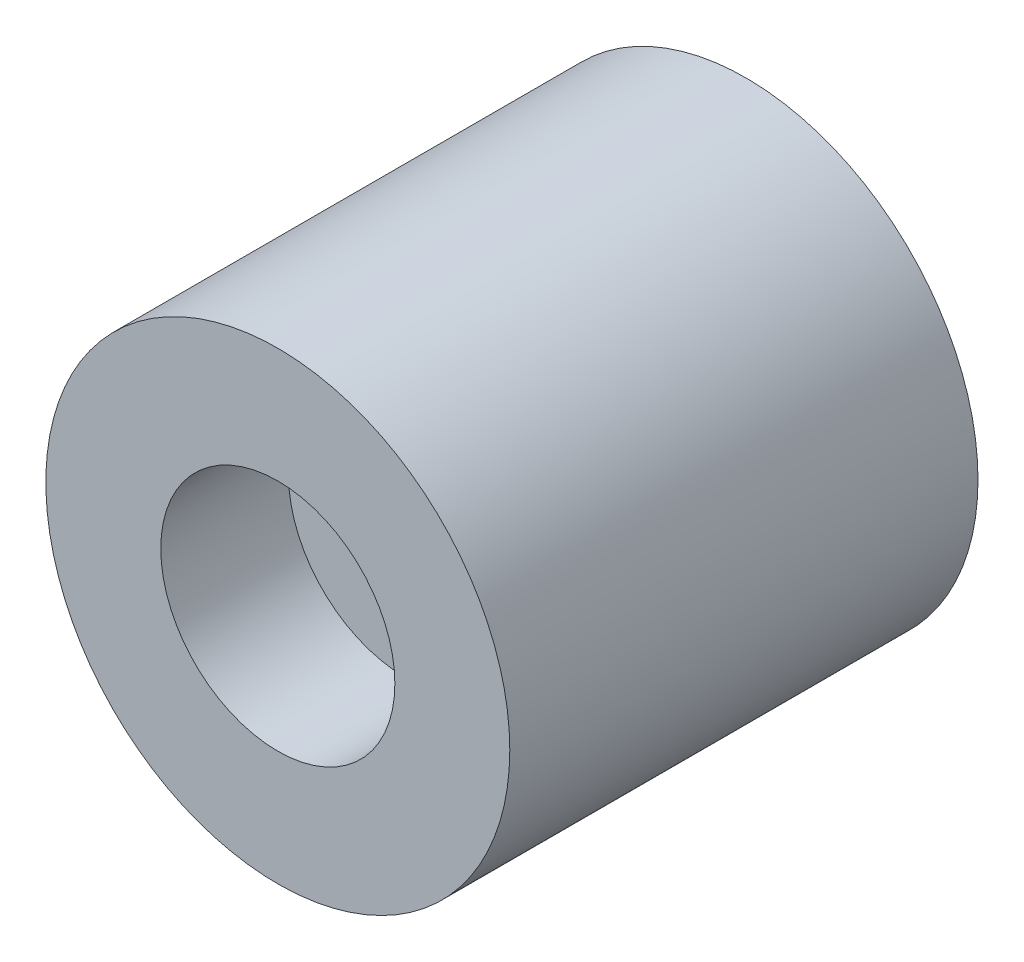
ISO-10303-21;
HEADER;
FILE_DESCRIPTION(('STEP AP214'),'2;1');
FILE_NAME('part.step','',(''),(''),'','','');
FILE_SCHEMA(('AUTOMOTIVE_DESIGN { 1 0 10303 214 1 1 1 1 }'));
ENDSEC;
DATA;
#1=APPLICATION_CONTEXT('core data for automotive mechanical design processes');
#2=APPLICATION_PROTOCOL_DEFINITION('international standard','automotive_design',2000,#1);
#3=PRODUCT_CONTEXT('',#1,'mechanical');
#4=PRODUCT('Part','Part','',(#3));
#5=PRODUCT_RELATED_PRODUCT_CATEGORY('part','',(#4));
#6=PRODUCT_DEFINITION_FORMATION('','',#4);
#7=PRODUCT_DEFINITION_CONTEXT('part definition',#1,'design');
#8=PRODUCT_DEFINITION('design','',#6,#7);
#9=PRODUCT_DEFINITION_SHAPE('','',#8);
#10=(LENGTH_UNIT() NAMED_UNIT(*) SI_UNIT(.MILLI.,.METRE.));
#11=(NAMED_UNIT(*) PLANE_ANGLE_UNIT() SI_UNIT($,.RADIAN.));
#12=(NAMED_UNIT(*) SI_UNIT($,.STERADIAN.) SOLID_ANGLE_UNIT());
#13=UNCERTAINTY_MEASURE_WITH_UNIT(LENGTH_MEASURE(1.E-05),#10,'distance_accuracy_value','');
#14=(GEOMETRIC_REPRESENTATION_CONTEXT(3) GLOBAL_UNCERTAINTY_ASSIGNED_CONTEXT((#13)) GLOBAL_UNIT_ASSIGNED_CONTEXT((#10,
#11,#12)) REPRESENTATION_CONTEXT('',''));
#15=CARTESIAN_POINT('',(0.,0.,0.));
#16=DIRECTION('',(0.,0.,1.));
#17=DIRECTION('',(1.,0.,0.));
#18=AXIS2_PLACEMENT_3D('',#15,#16,#17);
#19=CARTESIAN_POINT('',(0.,0.,11.));
#20=DIRECTION('',(0.,0.,-1.));
#21=DIRECTION('',(-1.,0.,0.));
#22=AXIS2_PLACEMENT_3D('',#19,#20,#21);
#23=CYLINDRICAL_SURFACE('',#22,5.45);
#24=CARTESIAN_POINT('',(0.,0.,11.));
#25=DIRECTION('',(0.,0.,1.));
#26=DIRECTION('',(1.,0.,0.));
#27=AXIS2_PLACEMENT_3D('',#24,#25,#26);
#28=CIRCLE('',#27,5.45);
#29=CARTESIAN_POINT('',(5.45,0.,11.));
#30=VERTEX_POINT('',#29);
#31=EDGE_CURVE('E10',#30,#30,#28,.T.);
#32=ORIENTED_EDGE('',*,*,#31,.F.);
#33=EDGE_LOOP('',(#32));
#34=FACE_BOUND('',#33,.T.);
#35=CARTESIAN_POINT('',(0.,0.,0.));
#36=DIRECTION('',(0.,0.,1.));
#37=DIRECTION('',(1.,0.,0.));
#38=AXIS2_PLACEMENT_3D('',#35,#36,#37);
#39=CIRCLE('',#38,5.45);
#40=CARTESIAN_POINT('',(5.45,0.,0.));
#41=VERTEX_POINT('',#40);
#42=EDGE_CURVE('E35',#41,#41,#39,.T.);
#43=ORIENTED_EDGE('',*,*,#42,.T.);
#44=EDGE_LOOP('',(#43));
#45=FACE_BOUND('',#44,.T.);
#46=ADVANCED_FACE('F32',(#34,#45),#23,.T.);
#47=CARTESIAN_POINT('',(0.,0.,11.));
#48=DIRECTION('',(0.,0.,1.));
#49=DIRECTION('',(1.,0.,0.));
#50=AXIS2_PLACEMENT_3D('',#47,#48,#49);
#51=PLANE('',#50);
#52=CARTESIAN_POINT('',(0.,0.,11.));
#53=DIRECTION('',(0.,0.,1.));
#54=DIRECTION('',(1.,0.,0.));
#55=AXIS2_PLACEMENT_3D('',#52,#53,#54);
#56=CIRCLE('',#55,2.75);
#57=CARTESIAN_POINT('',(2.75,0.,11.));
#58=VERTEX_POINT('',#57);
#59=EDGE_CURVE('E44',#58,#58,#56,.T.);
#60=ORIENTED_EDGE('',*,*,#59,.F.);
#61=EDGE_LOOP('',(#60));
#62=FACE_BOUND('',#61,.T.);
#63=ORIENTED_EDGE('',*,*,#31,.T.);
#64=EDGE_LOOP('',(#63));
#65=FACE_BOUND('',#64,.T.);
#66=ADVANCED_FACE('F59',(#62,#65),#51,.T.);
#67=CARTESIAN_POINT('',(0.,0.,0.));
#68=DIRECTION('',(0.,0.,1.));
#69=DIRECTION('',(1.,0.,0.));
#70=AXIS2_PLACEMENT_3D('',#67,#68,#69);
#71=PLANE('',#70);
#72=ORIENTED_EDGE('',*,*,#42,.F.);
#73=EDGE_LOOP('',(#72));
#74=FACE_BOUND('',#73,.T.);
#75=ADVANCED_FACE('F55',(#74),#71,.F.);
#76=CARTESIAN_POINT('',(0.,0.,8.));
#77=DIRECTION('',(0.,0.,1.));
#78=DIRECTION('',(1.,0.,0.));
#79=AXIS2_PLACEMENT_3D('',#76,#77,#78);
#80=CYLINDRICAL_SURFACE('',#79,2.75);
#81=CARTESIAN_POINT('',(0.,0.,8.));
#82=DIRECTION('',(0.,0.,1.));
#83=DIRECTION('',(1.,0.,0.));
#84=AXIS2_PLACEMENT_3D('',#81,#82,#83);
#85=CIRCLE('',#84,2.75);
#86=CARTESIAN_POINT('',(2.75,0.,8.));
#87=VERTEX_POINT('',#86);
#88=EDGE_CURVE('E42',#87,#87,#85,.T.);
#89=ORIENTED_EDGE('',*,*,#88,.F.);
#90=EDGE_LOOP('',(#89));
#91=FACE_BOUND('',#90,.T.);
#92=ORIENTED_EDGE('',*,*,#59,.T.);
#93=EDGE_LOOP('',(#92));
#94=FACE_BOUND('',#93,.T.);
#95=ADVANCED_FACE('F52',(#91,#94),#80,.F.);
#96=CARTESIAN_POINT('',(0.,0.,8.));
#97=DIRECTION('',(0.,0.,1.));
#98=DIRECTION('',(1.,0.,0.));
#99=AXIS2_PLACEMENT_3D('',#96,#97,#98);
#100=PLANE('',#99);
#101=ORIENTED_EDGE('',*,*,#88,.T.);
#102=EDGE_LOOP('',(#101));
#103=FACE_BOUND('',#102,.T.);
#104=ADVANCED_FACE('F50',(#103),#100,.T.);
#105=CLOSED_SHELL('',(#46,#66,#75,#95,#104));
#106=MANIFOLD_SOLID_BREP('B2',#105);
#107=ADVANCED_BREP_SHAPE_REPRESENTATION('',(#18,#106),#14);
#108=SHAPE_DEFINITION_REPRESENTATION(#9,#107);
ENDSEC;
END-ISO-10303-21;
